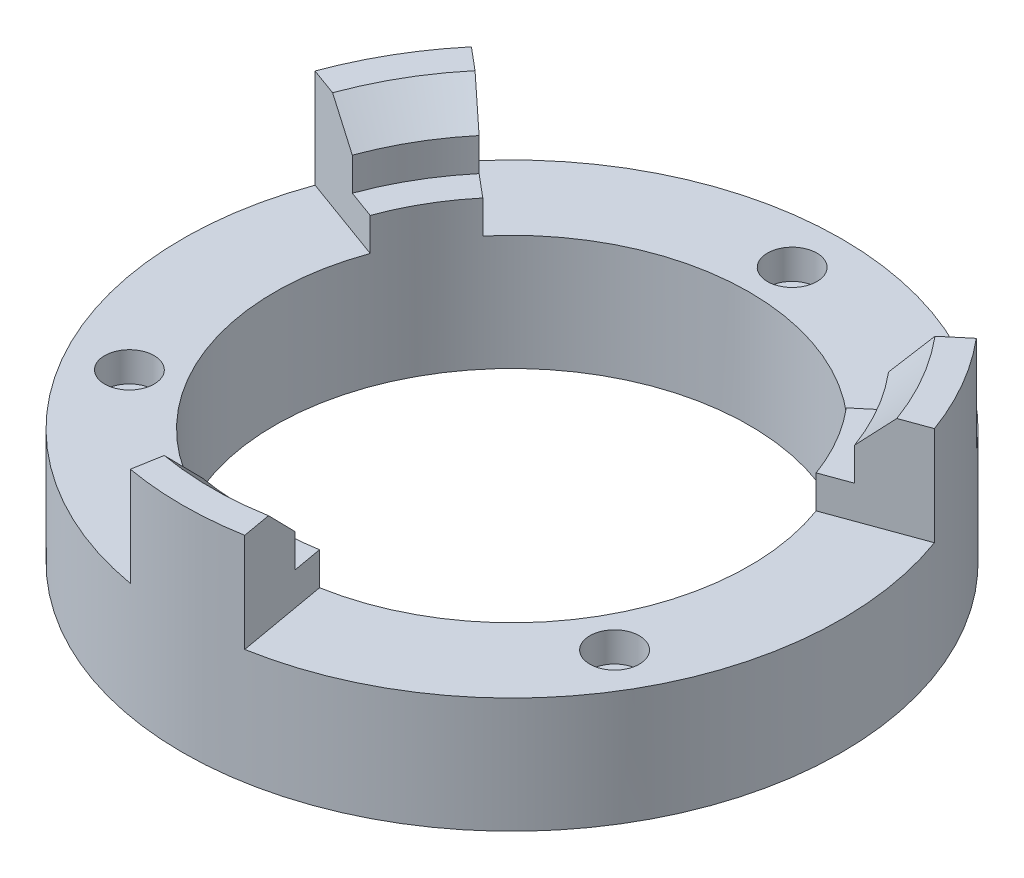
ISO-10303-21;
HEADER;
FILE_DESCRIPTION(('STEP AP214'),'2;1');
FILE_NAME('part.step','',(''),(''),'','','');
FILE_SCHEMA(('AUTOMOTIVE_DESIGN { 1 0 10303 214 1 1 1 1 }'));
ENDSEC;
DATA;
#1=APPLICATION_CONTEXT('core data for automotive mechanical design processes');
#2=APPLICATION_PROTOCOL_DEFINITION('international standard','automotive_design',2000,#1);
#3=PRODUCT_CONTEXT('',#1,'mechanical');
#4=PRODUCT('Part','Part','',(#3));
#5=PRODUCT_RELATED_PRODUCT_CATEGORY('part','',(#4));
#6=PRODUCT_DEFINITION_FORMATION('','',#4);
#7=PRODUCT_DEFINITION_CONTEXT('part definition',#1,'design');
#8=PRODUCT_DEFINITION('design','',#6,#7);
#9=PRODUCT_DEFINITION_SHAPE('','',#8);
#10=(LENGTH_UNIT() NAMED_UNIT(*) SI_UNIT(.MILLI.,.METRE.));
#11=(NAMED_UNIT(*) PLANE_ANGLE_UNIT() SI_UNIT($,.RADIAN.));
#12=(NAMED_UNIT(*) SI_UNIT($,.STERADIAN.) SOLID_ANGLE_UNIT());
#13=UNCERTAINTY_MEASURE_WITH_UNIT(LENGTH_MEASURE(1.E-05),#10,'distance_accuracy_value','');
#14=(GEOMETRIC_REPRESENTATION_CONTEXT(3) GLOBAL_UNCERTAINTY_ASSIGNED_CONTEXT((#13)) GLOBAL_UNIT_ASSIGNED_CONTEXT((#10,
#11,#12)) REPRESENTATION_CONTEXT('',''));
#15=CARTESIAN_POINT('',(0.,0.,0.));
#16=DIRECTION('',(0.,0.,1.));
#17=DIRECTION('',(1.,0.,0.));
#18=AXIS2_PLACEMENT_3D('',#15,#16,#17);
#19=CARTESIAN_POINT('',(0.,65.,0.));
#20=DIRECTION('',(0.,1.,0.));
#21=DIRECTION('',(0.,0.,1.));
#22=AXIS2_PLACEMENT_3D('',#19,#20,#21);
#23=PLANE('',#22);
#24=DIRECTION('',(-0.939692620785905,0.,-0.342020143325679));
#25=VECTOR('',#24,1.);
#26=CARTESIAN_POINT('',(0.,65.,0.));
#27=LINE('',#26,#25);
#28=CARTESIAN_POINT('',(-85.6059977535959,65.,-31.1580350569694));
#29=VERTEX_POINT('',#28);
#30=CARTESIAN_POINT('',(-93.9692620785905,65.,-34.2020143325679));
#31=VERTEX_POINT('',#30);
#32=EDGE_CURVE('E254',#29,#31,#27,.T.);
#33=ORIENTED_EDGE('',*,*,#32,.F.);
#34=CARTESIAN_POINT('',(0.,65.,0.));
#35=DIRECTION('',(0.,1.,0.));
#36=DIRECTION('',(0.,0.,1.));
#37=AXIS2_PLACEMENT_3D('',#34,#35,#36);
#38=CIRCLE('',#37,91.1);
#39=CARTESIAN_POINT('',(-69.7866487681386,65.,-58.5579512424442));
#40=VERTEX_POINT('',#39);
#41=EDGE_CURVE('E377',#29,#40,#38,.F.);
#42=ORIENTED_EDGE('',*,*,#41,.T.);
#43=DIRECTION('',(0.766044443118975,0.,0.642787609686543));
#44=VECTOR('',#43,1.);
#45=CARTESIAN_POINT('',(-620.584017996697,65.,-520.731820615549));
#46=LINE('',#45,#44);
#47=CARTESIAN_POINT('',(-76.6044443118974,65.,-64.2787609686543));
#48=VERTEX_POINT('',#47);
#49=EDGE_CURVE('E698',#48,#40,#46,.T.);
#50=ORIENTED_EDGE('',*,*,#49,.F.);
#51=CARTESIAN_POINT('',(0.,65.,0.));
#52=DIRECTION('',(0.,1.,0.));
#53=DIRECTION('',(0.,0.,1.));
#54=AXIS2_PLACEMENT_3D('',#51,#52,#53);
#55=CIRCLE('',#54,100.);
#56=EDGE_CURVE('E359',#48,#31,#55,.T.);
#57=ORIENTED_EDGE('',*,*,#56,.T.);
#58=EDGE_LOOP('',(#33,#42,#50,#57));
#59=FACE_BOUND('',#58,.T.);
#60=ADVANCED_FACE('F17',(#59),#23,.T.);
#61=CARTESIAN_POINT('',(0.,45.,0.));
#62=DIRECTION('',(0.,1.,0.));
#63=DIRECTION('',(0.,0.,1.));
#64=AXIS2_PLACEMENT_3D('',#61,#62,#63);
#65=CYLINDRICAL_SURFACE('',#64,81.1);
#66=CARTESIAN_POINT('',(0.,55.,0.));
#67=DIRECTION('',(0.,1.,0.));
#68=DIRECTION('',(0.,0.,1.));
#69=AXIS2_PLACEMENT_3D('',#66,#67,#68);
#70=CIRCLE('',#69,81.1);
#71=CARTESIAN_POINT('',(-62.1262043369488,55.,-52.1300751455787));
#72=VERTEX_POINT('',#71);
#73=CARTESIAN_POINT('',(-76.2090715457369,55.,-27.7378336237126));
#74=VERTEX_POINT('',#73);
#75=EDGE_CURVE('E370',#72,#74,#70,.T.);
#76=ORIENTED_EDGE('',*,*,#75,.T.);
#77=DIRECTION('',(0.,1.,0.));
#78=VECTOR('',#77,1.);
#79=CARTESIAN_POINT('',(-76.2090715457369,45.,-27.7378336237126));
#80=LINE('',#79,#78);
#81=CARTESIAN_POINT('',(-76.2090715457369,45.,-27.7378336237126));
#82=VERTEX_POINT('',#81);
#83=EDGE_CURVE('E235',#74,#82,#80,.F.);
#84=ORIENTED_EDGE('',*,*,#83,.T.);
#85=CARTESIAN_POINT('',(0.,45.,0.));
#86=DIRECTION('',(0.,1.,0.));
#87=DIRECTION('',(0.,0.,1.));
#88=AXIS2_PLACEMENT_3D('',#85,#86,#87);
#89=CIRCLE('',#88,81.1);
#90=CARTESIAN_POINT('',(-62.1262043369488,45.,-52.1300751455787));
#91=VERTEX_POINT('',#90);
#92=EDGE_CURVE('E361',#91,#82,#89,.T.);
#93=ORIENTED_EDGE('',*,*,#92,.F.);
#94=DIRECTION('',(0.,1.,0.));
#95=VECTOR('',#94,1.);
#96=CARTESIAN_POINT('',(-62.1262043369488,45.,-52.1300751455787));
#97=LINE('',#96,#95);
#98=EDGE_CURVE('E679',#91,#72,#97,.T.);
#99=ORIENTED_EDGE('',*,*,#98,.T.);
#100=EDGE_LOOP('',(#76,#84,#93,#99));
#101=FACE_BOUND('',#100,.T.);
#102=ADVANCED_FACE('F312',(#101),#65,.F.);
#103=CARTESIAN_POINT('',(0.,45.,0.));
#104=DIRECTION('',(0.,1.,0.));
#105=DIRECTION('',(0.,0.,1.));
#106=AXIS2_PLACEMENT_3D('',#103,#104,#105);
#107=PLANE('',#106);
#108=DIRECTION('',(-0.939692620785905,0.,-0.342020143325679));
#109=VECTOR('',#108,1.);
#110=CARTESIAN_POINT('',(0.,45.,0.));
#111=LINE('',#110,#109);
#112=CARTESIAN_POINT('',(-67.6578686965851,45.,-24.6254503194488));
#113=VERTEX_POINT('',#112);
#114=EDGE_CURVE('E238',#113,#82,#111,.T.);
#115=ORIENTED_EDGE('',*,*,#114,.F.);
#116=CARTESIAN_POINT('',(0.,45.,0.));
#117=DIRECTION('',(0.,1.,0.));
#118=DIRECTION('',(0.,0.,1.));
#119=AXIS2_PLACEMENT_3D('',#116,#117,#118);
#120=CIRCLE('',#119,72.);
#121=CARTESIAN_POINT('',(-55.1551999045661,45.,-46.2807078974312));
#122=VERTEX_POINT('',#121);
#123=EDGE_CURVE('E179',#122,#113,#120,.T.);
#124=ORIENTED_EDGE('',*,*,#123,.F.);
#125=DIRECTION('',(0.766044443118975,0.,0.642787609686543));
#126=VECTOR('',#125,1.);
#127=CARTESIAN_POINT('',(0.,45.,0.));
#128=LINE('',#127,#126);
#129=EDGE_CURVE('E694',#91,#122,#128,.T.);
#130=ORIENTED_EDGE('',*,*,#129,.F.);
#131=ORIENTED_EDGE('',*,*,#92,.T.);
#132=EDGE_LOOP('',(#115,#124,#130,#131));
#133=FACE_BOUND('',#132,.T.);
#134=ADVANCED_FACE('F321',(#133),#107,.T.);
#135=CARTESIAN_POINT('',(0.,55.,0.));
#136=DIRECTION('',(0.,1.,0.));
#137=DIRECTION('',(0.,0.,1.));
#138=AXIS2_PLACEMENT_3D('',#135,#136,#137);
#139=CONICAL_SURFACE('',#138,81.1,0.785398163397452);
#140=DIRECTION('',(-0.664463024388674,0.707106781186545,-0.241844762647983));
#141=VECTOR('',#140,1.);
#142=CARTESIAN_POINT('',(0.,-26.0999999999994,0.));
#143=LINE('',#142,#141);
#144=EDGE_CURVE('E233',#74,#29,#143,.T.);
#145=ORIENTED_EDGE('',*,*,#144,.F.);
#146=ORIENTED_EDGE('',*,*,#75,.F.);
#147=DIRECTION('',(0.541675220419701,-0.707106781186545,0.454519477672048));
#148=VECTOR('',#147,1.);
#149=CARTESIAN_POINT('',(0.,-26.0999999999994,0.));
#150=LINE('',#149,#148);
#151=EDGE_CURVE('E385',#40,#72,#150,.T.);
#152=ORIENTED_EDGE('',*,*,#151,.F.);
#153=ORIENTED_EDGE('',*,*,#41,.F.);
#154=EDGE_LOOP('',(#145,#146,#152,#153));
#155=FACE_BOUND('',#154,.T.);
#156=ADVANCED_FACE('F329',(#155),#139,.F.);
#157=DIRECTION('',(0.173648177666945,0.,-0.984807753012206));
#158=VECTOR('',#157,1.);
#159=CARTESIAN_POINT('',(-140.674976213645,65.,797.807435075532));
#160=LINE('',#159,#158);
#161=CARTESIAN_POINT('',(-17.3648177666945,65.,98.4807753012206));
#162=VERTEX_POINT('',#161);
#163=CARTESIAN_POINT('',(-15.8193489854587,65.,89.7159862994119));
#164=VERTEX_POINT('',#163);
#165=EDGE_CURVE('E251',#162,#164,#160,.T.);
#166=ORIENTED_EDGE('',*,*,#165,.F.);
#167=CARTESIAN_POINT('',(17.3648177666925,65.,98.480775301221));
#168=VERTEX_POINT('',#167);
#169=EDGE_CURVE('E356',#162,#168,#55,.T.);
#170=ORIENTED_EDGE('',*,*,#169,.T.);
#171=DIRECTION('',(0.173648177666925,0.,0.984807753012209));
#172=VECTOR('',#171,1.);
#173=CARTESIAN_POINT('',(0.,65.,0.));
#174=LINE('',#173,#172);
#175=CARTESIAN_POINT('',(15.8193489854568,65.,89.7159862994123));
#176=VERTEX_POINT('',#175);
#177=EDGE_CURVE('E226',#176,#168,#174,.T.);
#178=ORIENTED_EDGE('',*,*,#177,.F.);
#179=EDGE_CURVE('E380',#176,#164,#38,.F.);
#180=ORIENTED_EDGE('',*,*,#179,.T.);
#181=EDGE_LOOP('',(#166,#170,#178,#180));
#182=FACE_BOUND('',#181,.T.);
#183=ADVANCED_FACE('F315',(#182),#23,.T.);
#184=CARTESIAN_POINT('',(-14.0828672087893,45.,79.8679087692898));
#185=VERTEX_POINT('',#184);
#186=CARTESIAN_POINT('',(14.0828672087875,45.,79.8679087692902));
#187=VERTEX_POINT('',#186);
#188=EDGE_CURVE('E408',#185,#187,#89,.T.);
#189=ORIENTED_EDGE('',*,*,#188,.F.);
#190=DIRECTION('',(0.,1.,0.));
#191=VECTOR('',#190,1.);
#192=CARTESIAN_POINT('',(-14.0828672087893,45.,79.8679087692898));
#193=LINE('',#192,#191);
#194=CARTESIAN_POINT('',(-14.0828672087893,55.,79.8679087692898));
#195=VERTEX_POINT('',#194);
#196=EDGE_CURVE('E245',#185,#195,#193,.T.);
#197=ORIENTED_EDGE('',*,*,#196,.T.);
#198=CARTESIAN_POINT('',(14.0828672087875,55.,79.8679087692902));
#199=VERTEX_POINT('',#198);
#200=EDGE_CURVE('E368',#195,#199,#70,.T.);
#201=ORIENTED_EDGE('',*,*,#200,.T.);
#202=DIRECTION('',(0.,1.,0.));
#203=VECTOR('',#202,1.);
#204=CARTESIAN_POINT('',(14.0828672087875,45.,79.8679087692902));
#205=LINE('',#204,#203);
#206=EDGE_CURVE('E203',#199,#187,#205,.F.);
#207=ORIENTED_EDGE('',*,*,#206,.T.);
#208=EDGE_LOOP('',(#189,#197,#201,#207));
#209=FACE_BOUND('',#208,.T.);
#210=ADVANCED_FACE('F324',(#209),#65,.F.);
#211=DIRECTION('',(0.173648177666945,0.,-0.984807753012206));
#212=VECTOR('',#211,1.);
#213=CARTESIAN_POINT('',(0.,45.,0.));
#214=LINE('',#213,#212);
#215=CARTESIAN_POINT('',(-12.5026687920201,45.,70.9061582168788));
#216=VERTEX_POINT('',#215);
#217=EDGE_CURVE('E248',#185,#216,#214,.T.);
#218=ORIENTED_EDGE('',*,*,#217,.F.);
#219=ORIENTED_EDGE('',*,*,#188,.T.);
#220=DIRECTION('',(0.173648177666924,0.,0.984807753012209));
#221=VECTOR('',#220,1.);
#222=CARTESIAN_POINT('',(0.,45.,0.));
#223=LINE('',#222,#221);
#224=CARTESIAN_POINT('',(12.5026687920185,45.,70.9061582168791));
#225=VERTEX_POINT('',#224);
#226=EDGE_CURVE('E208',#225,#187,#223,.T.);
#227=ORIENTED_EDGE('',*,*,#226,.F.);
#228=EDGE_CURVE('E186',#216,#225,#120,.T.);
#229=ORIENTED_EDGE('',*,*,#228,.F.);
#230=EDGE_LOOP('',(#218,#219,#227,#229));
#231=FACE_BOUND('',#230,.T.);
#232=ADVANCED_FACE('F406',(#231),#107,.T.);
#233=DIRECTION('',(0.122787803968983,-0.707106781186545,-0.69636424032002));
#234=VECTOR('',#233,1.);
#235=CARTESIAN_POINT('',(0.,-26.0999999999994,0.));
#236=LINE('',#235,#234);
#237=EDGE_CURVE('E243',#164,#195,#236,.T.);
#238=ORIENTED_EDGE('',*,*,#237,.F.);
#239=ORIENTED_EDGE('',*,*,#179,.F.);
#240=DIRECTION('',(0.122787803968969,0.707106781186545,0.696364240320022));
#241=VECTOR('',#240,1.);
#242=CARTESIAN_POINT('',(0.,-26.0999999999994,0.));
#243=LINE('',#242,#241);
#244=EDGE_CURVE('E198',#199,#176,#243,.T.);
#245=ORIENTED_EDGE('',*,*,#244,.F.);
#246=ORIENTED_EDGE('',*,*,#200,.F.);
#247=EDGE_LOOP('',(#238,#239,#245,#246));
#248=FACE_BOUND('',#247,.T.);
#249=ADVANCED_FACE('F341',(#248),#139,.F.);
#250=CARTESIAN_POINT('',(0.,65.,0.));
#251=DIRECTION('',(0.,-1.,0.));
#252=DIRECTION('',(0.,0.,-1.));
#253=AXIS2_PLACEMENT_3D('',#250,#251,#252);
#254=CYLINDRICAL_SURFACE('',#253,100.);
#255=CARTESIAN_POINT('',(0.,35.,0.));
#256=DIRECTION('',(0.,-1.,0.));
#257=DIRECTION('',(0.,0.,-1.));
#258=AXIS2_PLACEMENT_3D('',#255,#256,#257);
#259=CIRCLE('',#258,100.);
#260=CARTESIAN_POINT('',(-17.3648177666945,35.,98.4807753012206));
#261=VERTEX_POINT('',#260);
#262=CARTESIAN_POINT('',(-93.9692620785905,35.,-34.2020143325679));
#263=VERTEX_POINT('',#262);
#264=EDGE_CURVE('E250',#261,#263,#259,.T.);
#265=ORIENTED_EDGE('',*,*,#264,.T.);
#266=DIRECTION('',(0.,-1.,0.));
#267=VECTOR('',#266,1.);
#268=CARTESIAN_POINT('',(-93.9692620785905,65.,-34.2020143325679));
#269=LINE('',#268,#267);
#270=EDGE_CURVE('E172',#263,#31,#269,.F.);
#271=ORIENTED_EDGE('',*,*,#270,.T.);
#272=ORIENTED_EDGE('',*,*,#56,.F.);
#273=DIRECTION('',(0.,-1.,0.));
#274=VECTOR('',#273,1.);
#275=CARTESIAN_POINT('',(-76.6044443118974,65.,-64.2787609686544));
#276=LINE('',#275,#274);
#277=CARTESIAN_POINT('',(-76.6044443118974,35.,-64.2787609686544));
#278=VERTEX_POINT('',#277);
#279=EDGE_CURVE('E691',#48,#278,#276,.T.);
#280=ORIENTED_EDGE('',*,*,#279,.T.);
#281=CARTESIAN_POINT('',(0.,35.,0.));
#282=DIRECTION('',(0.,-1.,0.));
#283=DIRECTION('',(0.,0.,-1.));
#284=AXIS2_PLACEMENT_3D('',#281,#282,#283);
#285=CIRCLE('',#284,100.);
#286=CARTESIAN_POINT('',(76.6044443118979,35.,-64.2787609686538));
#287=VERTEX_POINT('',#286);
#288=EDGE_CURVE('E389',#278,#287,#285,.T.);
#289=ORIENTED_EDGE('',*,*,#288,.T.);
#290=DIRECTION('',(0.,-1.,0.));
#291=VECTOR('',#290,1.);
#292=CARTESIAN_POINT('',(76.6044443118979,65.,-64.2787609686538));
#293=LINE('',#292,#291);
#294=CARTESIAN_POINT('',(76.6044443118979,65.,-64.2787609686538));
#295=VERTEX_POINT('',#294);
#296=EDGE_CURVE('E355',#287,#295,#293,.F.);
#297=ORIENTED_EDGE('',*,*,#296,.T.);
#298=CARTESIAN_POINT('',(93.9692620785909,65.,-34.2020143325658));
#299=VERTEX_POINT('',#298);
#300=EDGE_CURVE('E346',#299,#295,#55,.T.);
#301=ORIENTED_EDGE('',*,*,#300,.F.);
#302=DIRECTION('',(0.,-1.,0.));
#303=VECTOR('',#302,1.);
#304=CARTESIAN_POINT('',(93.9692620785912,65.,-34.2020143325659));
#305=LINE('',#304,#303);
#306=CARTESIAN_POINT('',(93.9692620785912,35.,-34.2020143325659));
#307=VERTEX_POINT('',#306);
#308=EDGE_CURVE('E211',#299,#307,#305,.T.);
#309=ORIENTED_EDGE('',*,*,#308,.T.);
#310=CARTESIAN_POINT('',(0.,35.,0.));
#311=DIRECTION('',(0.,-1.,0.));
#312=DIRECTION('',(0.,0.,-1.));
#313=AXIS2_PLACEMENT_3D('',#310,#311,#312);
#314=CIRCLE('',#313,100.);
#315=CARTESIAN_POINT('',(17.3648177666925,35.,98.4807753012209));
#316=VERTEX_POINT('',#315);
#317=EDGE_CURVE('E221',#307,#316,#314,.T.);
#318=ORIENTED_EDGE('',*,*,#317,.T.);
#319=DIRECTION('',(0.,-1.,0.));
#320=VECTOR('',#319,1.);
#321=CARTESIAN_POINT('',(17.3648177666924,65.,98.4807753012209));
#322=LINE('',#321,#320);
#323=EDGE_CURVE('E193',#316,#168,#322,.F.);
#324=ORIENTED_EDGE('',*,*,#323,.T.);
#325=ORIENTED_EDGE('',*,*,#169,.F.);
#326=DIRECTION('',(0.,-1.,0.));
#327=VECTOR('',#326,1.);
#328=CARTESIAN_POINT('',(-17.3648177666945,65.,98.4807753012206));
#329=LINE('',#328,#327);
#330=EDGE_CURVE('E240',#162,#261,#329,.T.);
#331=ORIENTED_EDGE('',*,*,#330,.T.);
#332=EDGE_LOOP('',(#265,#271,#272,#280,#289,#297,#301,#309,#318,#324,#325,#331));
#333=FACE_BOUND('',#332,.T.);
#334=CARTESIAN_POINT('',(0.,0.,0.));
#335=DIRECTION('',(0.,1.,0.));
#336=DIRECTION('',(0.,0.,1.));
#337=AXIS2_PLACEMENT_3D('',#334,#335,#336);
#338=CIRCLE('',#337,100.);
#339=CARTESIAN_POINT('',(0.,0.,100.));
#340=VERTEX_POINT('',#339);
#341=EDGE_CURVE('E357',#340,#340,#338,.T.);
#342=ORIENTED_EDGE('',*,*,#341,.T.);
#343=EDGE_LOOP('',(#342));
#344=FACE_BOUND('',#343,.T.);
#345=ADVANCED_FACE('F333',(#333,#344),#254,.T.);
#346=DIRECTION('',(-0.939692620785912,0.,0.342020143325659));
#347=VECTOR('',#346,1.);
#348=CARTESIAN_POINT('',(761.258994210337,65.,-277.075614459981));
#349=LINE('',#348,#347);
#350=CARTESIAN_POINT('',(85.6059977535966,65.,-31.1580350569675));
#351=VERTEX_POINT('',#350);
#352=EDGE_CURVE('E223',#299,#351,#349,.T.);
#353=ORIENTED_EDGE('',*,*,#352,.F.);
#354=ORIENTED_EDGE('',*,*,#300,.T.);
#355=DIRECTION('',(0.766044443118979,0.,-0.642787609686538));
#356=VECTOR('',#355,1.);
#357=CARTESIAN_POINT('',(0.,65.,0.));
#358=LINE('',#357,#356);
#359=CARTESIAN_POINT('',(69.786648768139,65.,-58.5579512424436));
#360=VERTEX_POINT('',#359);
#361=EDGE_CURVE('E701',#360,#295,#358,.T.);
#362=ORIENTED_EDGE('',*,*,#361,.F.);
#363=EDGE_CURVE('E349',#360,#351,#38,.F.);
#364=ORIENTED_EDGE('',*,*,#363,.T.);
#365=EDGE_LOOP('',(#353,#354,#362,#364));
#366=FACE_BOUND('',#365,.T.);
#367=ADVANCED_FACE('F316',(#366),#23,.T.);
#368=CARTESIAN_POINT('',(0.,0.,0.));
#369=DIRECTION('',(0.,1.,0.));
#370=DIRECTION('',(0.,0.,1.));
#371=AXIS2_PLACEMENT_3D('',#368,#369,#370);
#372=PLANE('',#371);
#373=CARTESIAN_POINT('',(73.6121593216777,0.,42.4999999999994));
#374=DIRECTION('',(0.,1.,0.));
#375=DIRECTION('',(-0.866025403784443,0.,-0.499999999999992));
#376=AXIS2_PLACEMENT_3D('',#373,#374,#375);
#377=CIRCLE('',#376,4.5);
#378=CARTESIAN_POINT('',(69.7150450046477,0.,40.2499999999994));
#379=VERTEX_POINT('',#378);
#380=EDGE_CURVE('E286',#379,#379,#377,.T.);
#381=ORIENTED_EDGE('',*,*,#380,.T.);
#382=EDGE_LOOP('',(#381));
#383=FACE_BOUND('',#382,.T.);
#384=CARTESIAN_POINT('',(-73.6121593216771,0.,42.5));
#385=DIRECTION('',(0.,1.,0.));
#386=DIRECTION('',(0.866025403784437,0.,-0.5));
#387=AXIS2_PLACEMENT_3D('',#384,#385,#386);
#388=CIRCLE('',#387,4.5);
#389=CARTESIAN_POINT('',(-69.7150450046471,0.,40.25));
#390=VERTEX_POINT('',#389);
#391=EDGE_CURVE('E274',#390,#390,#388,.T.);
#392=ORIENTED_EDGE('',*,*,#391,.T.);
#393=EDGE_LOOP('',(#392));
#394=FACE_BOUND('',#393,.T.);
#395=CARTESIAN_POINT('',(0.,0.,-85.));
#396=DIRECTION('',(0.,1.,0.));
#397=DIRECTION('',(0.,0.,1.));
#398=AXIS2_PLACEMENT_3D('',#395,#396,#397);
#399=CIRCLE('',#398,4.5);
#400=CARTESIAN_POINT('',(0.,0.,-80.5));
#401=VERTEX_POINT('',#400);
#402=EDGE_CURVE('E173',#401,#401,#399,.T.);
#403=ORIENTED_EDGE('',*,*,#402,.T.);
#404=EDGE_LOOP('',(#403));
#405=FACE_BOUND('',#404,.T.);
#406=CARTESIAN_POINT('',(0.,0.,0.));
#407=DIRECTION('',(0.,1.,0.));
#408=DIRECTION('',(0.,0.,1.));
#409=AXIS2_PLACEMENT_3D('',#406,#407,#408);
#410=CIRCLE('',#409,72.);
#411=CARTESIAN_POINT('',(0.,0.,72.));
#412=VERTEX_POINT('',#411);
#413=EDGE_CURVE('E185',#412,#412,#410,.T.);
#414=ORIENTED_EDGE('',*,*,#413,.T.);
#415=EDGE_LOOP('',(#414));
#416=FACE_BOUND('',#415,.T.);
#417=ORIENTED_EDGE('',*,*,#341,.F.);
#418=EDGE_LOOP('',(#417));
#419=FACE_BOUND('',#418,.T.);
#420=ADVANCED_FACE('F332',(#383,#394,#405,#416,#419),#372,.F.);
#421=CARTESIAN_POINT('',(76.2090715457374,45.,-27.7378336237109));
#422=VERTEX_POINT('',#421);
#423=CARTESIAN_POINT('',(62.1262043369492,45.,-52.1300751455782));
#424=VERTEX_POINT('',#423);
#425=EDGE_CURVE('E680',#422,#424,#89,.T.);
#426=ORIENTED_EDGE('',*,*,#425,.F.);
#427=DIRECTION('',(0.,1.,0.));
#428=VECTOR('',#427,1.);
#429=CARTESIAN_POINT('',(76.2090715457374,45.,-27.7378336237109));
#430=LINE('',#429,#428);
#431=CARTESIAN_POINT('',(76.2090715457374,55.,-27.7378336237109));
#432=VERTEX_POINT('',#431);
#433=EDGE_CURVE('E216',#422,#432,#430,.T.);
#434=ORIENTED_EDGE('',*,*,#433,.T.);
#435=CARTESIAN_POINT('',(62.1262043369492,55.,-52.1300751455782));
#436=VERTEX_POINT('',#435);
#437=EDGE_CURVE('E365',#432,#436,#70,.T.);
#438=ORIENTED_EDGE('',*,*,#437,.T.);
#439=DIRECTION('',(0.,1.,0.));
#440=VECTOR('',#439,1.);
#441=CARTESIAN_POINT('',(62.1262043369492,45.,-52.1300751455782));
#442=LINE('',#441,#440);
#443=EDGE_CURVE('E687',#436,#424,#442,.F.);
#444=ORIENTED_EDGE('',*,*,#443,.T.);
#445=EDGE_LOOP('',(#426,#434,#438,#444));
#446=FACE_BOUND('',#445,.T.);
#447=ADVANCED_FACE('F325',(#446),#65,.F.);
#448=DIRECTION('',(-0.939692620785912,0.,0.342020143325659));
#449=VECTOR('',#448,1.);
#450=CARTESIAN_POINT('',(0.,45.,0.));
#451=LINE('',#450,#449);
#452=CARTESIAN_POINT('',(67.6578686965857,45.,-24.6254503194475));
#453=VERTEX_POINT('',#452);
#454=EDGE_CURVE('E219',#422,#453,#451,.T.);
#455=ORIENTED_EDGE('',*,*,#454,.F.);
#456=ORIENTED_EDGE('',*,*,#425,.T.);
#457=DIRECTION('',(0.766044443118979,0.,-0.642787609686538));
#458=VECTOR('',#457,1.);
#459=CARTESIAN_POINT('',(0.,45.,0.));
#460=LINE('',#459,#458);
#461=CARTESIAN_POINT('',(55.1551999045665,45.,-46.2807078974308));
#462=VERTEX_POINT('',#461);
#463=EDGE_CURVE('E686',#462,#424,#460,.T.);
#464=ORIENTED_EDGE('',*,*,#463,.F.);
#465=EDGE_CURVE('E188',#453,#462,#120,.T.);
#466=ORIENTED_EDGE('',*,*,#465,.F.);
#467=EDGE_LOOP('',(#455,#456,#464,#466));
#468=FACE_BOUND('',#467,.T.);
#469=ADVANCED_FACE('F591',(#468),#107,.T.);
#470=DIRECTION('',(-0.66446302438868,-0.707106781186545,0.24184476264797));
#471=VECTOR('',#470,1.);
#472=CARTESIAN_POINT('',(0.,-26.0999999999994,0.));
#473=LINE('',#472,#471);
#474=EDGE_CURVE('E214',#351,#432,#473,.T.);
#475=ORIENTED_EDGE('',*,*,#474,.F.);
#476=ORIENTED_EDGE('',*,*,#363,.F.);
#477=DIRECTION('',(0.541675220419705,0.707106781186545,-0.454519477672045));
#478=VECTOR('',#477,1.);
#479=CARTESIAN_POINT('',(0.,-26.0999999999994,0.));
#480=LINE('',#479,#478);
#481=EDGE_CURVE('E386',#436,#360,#480,.T.);
#482=ORIENTED_EDGE('',*,*,#481,.F.);
#483=ORIENTED_EDGE('',*,*,#437,.F.);
#484=EDGE_LOOP('',(#475,#476,#482,#483));
#485=FACE_BOUND('',#484,.T.);
#486=ADVANCED_FACE('F19',(#485),#139,.F.);
#487=CARTESIAN_POINT('',(0.,35.,0.));
#488=DIRECTION('',(0.,-1.,0.));
#489=DIRECTION('',(0.,0.,-1.));
#490=AXIS2_PLACEMENT_3D('',#487,#488,#489);
#491=PLANE('',#490);
#492=CARTESIAN_POINT('',(0.,35.,-85.));
#493=DIRECTION('',(0.,1.,0.));
#494=DIRECTION('',(0.,0.,1.));
#495=AXIS2_PLACEMENT_3D('',#492,#493,#494);
#496=CIRCLE('',#495,7.5);
#497=CARTESIAN_POINT('',(0.,35.,-77.5));
#498=VERTEX_POINT('',#497);
#499=EDGE_CURVE('E265',#498,#498,#496,.T.);
#500=ORIENTED_EDGE('',*,*,#499,.F.);
#501=EDGE_LOOP('',(#500));
#502=FACE_BOUND('',#501,.T.);
#503=DIRECTION('',(0.766044443118975,0.,0.642787609686543));
#504=VECTOR('',#503,1.);
#505=CARTESIAN_POINT('',(-620.584017996697,35.,-520.731820615549));
#506=LINE('',#505,#504);
#507=CARTESIAN_POINT('',(-55.1551999045661,35.,-46.2807078974311));
#508=VERTEX_POINT('',#507);
#509=EDGE_CURVE('E697',#278,#508,#506,.T.);
#510=ORIENTED_EDGE('',*,*,#509,.T.);
#511=CARTESIAN_POINT('',(0.,35.,0.));
#512=DIRECTION('',(0.,-1.,0.));
#513=DIRECTION('',(0.,0.,-1.));
#514=AXIS2_PLACEMENT_3D('',#511,#512,#513);
#515=CIRCLE('',#514,72.);
#516=CARTESIAN_POINT('',(55.1551999045665,35.,-46.2807078974308));
#517=VERTEX_POINT('',#516);
#518=EDGE_CURVE('E190',#508,#517,#515,.T.);
#519=ORIENTED_EDGE('',*,*,#518,.T.);
#520=DIRECTION('',(0.766044443118979,0.,-0.642787609686538));
#521=VECTOR('',#520,1.);
#522=CARTESIAN_POINT('',(0.,35.,0.));
#523=LINE('',#522,#521);
#524=EDGE_CURVE('E700',#517,#287,#523,.T.);
#525=ORIENTED_EDGE('',*,*,#524,.T.);
#526=ORIENTED_EDGE('',*,*,#288,.F.);
#527=EDGE_LOOP('',(#510,#519,#525,#526));
#528=FACE_BOUND('',#527,.T.);
#529=ADVANCED_FACE('F572',(#502,#528),#491,.F.);
#530=CARTESIAN_POINT('',(0.,35.,0.));
#531=DIRECTION('',(0.642787609686538,0.,0.766044443118979));
#532=DIRECTION('',(0.766044443118979,0.,-0.642787609686538));
#533=AXIS2_PLACEMENT_3D('',#530,#531,#532);
#534=PLANE('',#533);
#535=ORIENTED_EDGE('',*,*,#524,.F.);
#536=DIRECTION('',(0.,1.,0.));
#537=VECTOR('',#536,1.);
#538=CARTESIAN_POINT('',(55.1551999045665,0.,-46.2807078974308));
#539=LINE('',#538,#537);
#540=EDGE_CURVE('E703',#517,#462,#539,.T.);
#541=ORIENTED_EDGE('',*,*,#540,.T.);
#542=ORIENTED_EDGE('',*,*,#463,.T.);
#543=ORIENTED_EDGE('',*,*,#443,.F.);
#544=ORIENTED_EDGE('',*,*,#481,.T.);
#545=ORIENTED_EDGE('',*,*,#361,.T.);
#546=ORIENTED_EDGE('',*,*,#296,.F.);
#547=EDGE_LOOP('',(#535,#541,#542,#543,#544,#545,#546));
#548=FACE_BOUND('',#547,.T.);
#549=ADVANCED_FACE('F563',(#548),#534,.F.);
#550=CARTESIAN_POINT('',(-620.584017996697,35.,-520.731820615549));
#551=DIRECTION('',(-0.642787609686543,0.,0.766044443118975));
#552=DIRECTION('',(0.766044443118975,0.,0.642787609686543));
#553=AXIS2_PLACEMENT_3D('',#550,#551,#552);
#554=PLANE('',#553);
#555=ORIENTED_EDGE('',*,*,#129,.T.);
#556=DIRECTION('',(0.,1.,0.));
#557=VECTOR('',#556,1.);
#558=CARTESIAN_POINT('',(-55.1551999045661,0.,-46.2807078974312));
#559=LINE('',#558,#557);
#560=EDGE_CURVE('E181',#122,#508,#559,.F.);
#561=ORIENTED_EDGE('',*,*,#560,.T.);
#562=ORIENTED_EDGE('',*,*,#509,.F.);
#563=ORIENTED_EDGE('',*,*,#279,.F.);
#564=ORIENTED_EDGE('',*,*,#49,.T.);
#565=ORIENTED_EDGE('',*,*,#151,.T.);
#566=ORIENTED_EDGE('',*,*,#98,.F.);
#567=EDGE_LOOP('',(#555,#561,#562,#563,#564,#565,#566));
#568=FACE_BOUND('',#567,.T.);
#569=ADVANCED_FACE('F554',(#568),#554,.F.);
#570=CARTESIAN_POINT('',(0.,0.,0.));
#571=DIRECTION('',(0.,1.,0.));
#572=DIRECTION('',(0.,0.,1.));
#573=AXIS2_PLACEMENT_3D('',#570,#571,#572);
#574=CYLINDRICAL_SURFACE('',#573,72.);
#575=ORIENTED_EDGE('',*,*,#123,.T.);
#576=DIRECTION('',(0.,1.,0.));
#577=VECTOR('',#576,1.);
#578=CARTESIAN_POINT('',(-67.6578686965851,0.,-24.6254503194488));
#579=LINE('',#578,#577);
#580=CARTESIAN_POINT('',(-67.6578686965851,35.,-24.6254503194489));
#581=VERTEX_POINT('',#580);
#582=EDGE_CURVE('E11',#113,#581,#579,.F.);
#583=ORIENTED_EDGE('',*,*,#582,.T.);
#584=CARTESIAN_POINT('',(0.,35.,0.));
#585=DIRECTION('',(0.,-1.,0.));
#586=DIRECTION('',(0.,0.,-1.));
#587=AXIS2_PLACEMENT_3D('',#584,#585,#586);
#588=CIRCLE('',#587,72.);
#589=CARTESIAN_POINT('',(-12.5026687920201,35.,70.9061582168788));
#590=VERTEX_POINT('',#589);
#591=EDGE_CURVE('E159',#581,#590,#588,.F.);
#592=ORIENTED_EDGE('',*,*,#591,.T.);
#593=DIRECTION('',(0.,1.,0.));
#594=VECTOR('',#593,1.);
#595=CARTESIAN_POINT('',(-12.5026687920201,0.,70.9061582168788));
#596=LINE('',#595,#594);
#597=EDGE_CURVE('E25',#590,#216,#596,.T.);
#598=ORIENTED_EDGE('',*,*,#597,.T.);
#599=ORIENTED_EDGE('',*,*,#228,.T.);
#600=DIRECTION('',(0.,1.,0.));
#601=VECTOR('',#600,1.);
#602=CARTESIAN_POINT('',(12.5026687920185,0.,70.9061582168791));
#603=LINE('',#602,#601);
#604=CARTESIAN_POINT('',(12.5026687920185,35.,70.9061582168791));
#605=VERTEX_POINT('',#604);
#606=EDGE_CURVE('E166',#225,#605,#603,.F.);
#607=ORIENTED_EDGE('',*,*,#606,.T.);
#608=CARTESIAN_POINT('',(0.,35.,0.));
#609=DIRECTION('',(0.,-1.,0.));
#610=DIRECTION('',(0.,0.,-1.));
#611=AXIS2_PLACEMENT_3D('',#608,#609,#610);
#612=CIRCLE('',#611,72.);
#613=CARTESIAN_POINT('',(67.6578686965857,35.,-24.6254503194475));
#614=VERTEX_POINT('',#613);
#615=EDGE_CURVE('E394',#605,#614,#612,.F.);
#616=ORIENTED_EDGE('',*,*,#615,.T.);
#617=DIRECTION('',(0.,1.,0.));
#618=VECTOR('',#617,1.);
#619=CARTESIAN_POINT('',(67.6578686965857,0.,-24.6254503194475));
#620=LINE('',#619,#618);
#621=EDGE_CURVE('E397',#614,#453,#620,.T.);
#622=ORIENTED_EDGE('',*,*,#621,.T.);
#623=ORIENTED_EDGE('',*,*,#465,.T.);
#624=ORIENTED_EDGE('',*,*,#540,.F.);
#625=ORIENTED_EDGE('',*,*,#518,.F.);
#626=ORIENTED_EDGE('',*,*,#560,.F.);
#627=EDGE_LOOP('',(#575,#583,#592,#598,#599,#607,#616,#622,#623,#624,#625,#626));
#628=FACE_BOUND('',#627,.T.);
#629=ORIENTED_EDGE('',*,*,#413,.F.);
#630=EDGE_LOOP('',(#629));
#631=FACE_BOUND('',#630,.T.);
#632=ADVANCED_FACE('F176',(#628,#631),#574,.F.);
#633=CARTESIAN_POINT('',(0.,35.,0.));
#634=DIRECTION('',(-0.984807753012209,0.,0.173648177666924));
#635=DIRECTION('',(0.173648177666924,0.,0.984807753012209));
#636=AXIS2_PLACEMENT_3D('',#633,#634,#635);
#637=PLANE('',#636);
#638=DIRECTION('',(0.173648177666925,0.,0.984807753012209));
#639=VECTOR('',#638,1.);
#640=CARTESIAN_POINT('',(0.,35.,0.));
#641=LINE('',#640,#639);
#642=EDGE_CURVE('E225',#605,#316,#641,.T.);
#643=ORIENTED_EDGE('',*,*,#642,.F.);
#644=ORIENTED_EDGE('',*,*,#606,.F.);
#645=ORIENTED_EDGE('',*,*,#226,.T.);
#646=ORIENTED_EDGE('',*,*,#206,.F.);
#647=ORIENTED_EDGE('',*,*,#244,.T.);
#648=ORIENTED_EDGE('',*,*,#177,.T.);
#649=ORIENTED_EDGE('',*,*,#323,.F.);
#650=EDGE_LOOP('',(#643,#644,#645,#646,#647,#648,#649));
#651=FACE_BOUND('',#650,.T.);
#652=ADVANCED_FACE('F307',(#651),#637,.F.);
#653=CARTESIAN_POINT('',(761.258994210337,35.,-277.075614459981));
#654=DIRECTION('',(-0.342020143325659,0.,-0.939692620785912));
#655=DIRECTION('',(-0.939692620785912,0.,0.342020143325659));
#656=AXIS2_PLACEMENT_3D('',#653,#654,#655);
#657=PLANE('',#656);
#658=ORIENTED_EDGE('',*,*,#352,.T.);
#659=ORIENTED_EDGE('',*,*,#474,.T.);
#660=ORIENTED_EDGE('',*,*,#433,.F.);
#661=ORIENTED_EDGE('',*,*,#454,.T.);
#662=ORIENTED_EDGE('',*,*,#621,.F.);
#663=DIRECTION('',(-0.939692620785912,0.,0.342020143325659));
#664=VECTOR('',#663,1.);
#665=CARTESIAN_POINT('',(761.258994210337,35.,-277.075614459981));
#666=LINE('',#665,#664);
#667=EDGE_CURVE('E40',#307,#614,#666,.T.);
#668=ORIENTED_EDGE('',*,*,#667,.F.);
#669=ORIENTED_EDGE('',*,*,#308,.F.);
#670=EDGE_LOOP('',(#658,#659,#660,#661,#662,#668,#669));
#671=FACE_BOUND('',#670,.T.);
#672=ADVANCED_FACE('F297',(#671),#657,.F.);
#673=CARTESIAN_POINT('',(0.,35.,0.));
#674=DIRECTION('',(0.,-1.,0.));
#675=DIRECTION('',(0.866025403784437,0.,0.5));
#676=AXIS2_PLACEMENT_3D('',#673,#674,#675);
#677=PLANE('',#676);
#678=CARTESIAN_POINT('',(73.6121593216777,35.,42.4999999999994));
#679=DIRECTION('',(0.,1.,0.));
#680=DIRECTION('',(-0.866025403784443,0.,-0.499999999999992));
#681=AXIS2_PLACEMENT_3D('',#678,#679,#680);
#682=CIRCLE('',#681,7.5);
#683=CARTESIAN_POINT('',(67.1169687932944,35.,38.7499999999994));
#684=VERTEX_POINT('',#683);
#685=EDGE_CURVE('E289',#684,#684,#682,.T.);
#686=ORIENTED_EDGE('',*,*,#685,.F.);
#687=EDGE_LOOP('',(#686));
#688=FACE_BOUND('',#687,.T.);
#689=ORIENTED_EDGE('',*,*,#667,.T.);
#690=ORIENTED_EDGE('',*,*,#615,.F.);
#691=ORIENTED_EDGE('',*,*,#642,.T.);
#692=ORIENTED_EDGE('',*,*,#317,.F.);
#693=EDGE_LOOP('',(#689,#690,#691,#692));
#694=FACE_BOUND('',#693,.T.);
#695=ADVANCED_FACE('F295',(#688,#694),#677,.F.);
#696=CARTESIAN_POINT('',(0.,35.,0.));
#697=DIRECTION('',(0.342020143325679,0.,-0.939692620785905));
#698=DIRECTION('',(-0.939692620785905,0.,-0.342020143325679));
#699=AXIS2_PLACEMENT_3D('',#696,#697,#698);
#700=PLANE('',#699);
#701=DIRECTION('',(-0.939692620785905,0.,-0.342020143325679));
#702=VECTOR('',#701,1.);
#703=CARTESIAN_POINT('',(0.,35.,0.));
#704=LINE('',#703,#702);
#705=EDGE_CURVE('E162',#581,#263,#704,.T.);
#706=ORIENTED_EDGE('',*,*,#705,.F.);
#707=ORIENTED_EDGE('',*,*,#582,.F.);
#708=ORIENTED_EDGE('',*,*,#114,.T.);
#709=ORIENTED_EDGE('',*,*,#83,.F.);
#710=ORIENTED_EDGE('',*,*,#144,.T.);
#711=ORIENTED_EDGE('',*,*,#32,.T.);
#712=ORIENTED_EDGE('',*,*,#270,.F.);
#713=EDGE_LOOP('',(#706,#707,#708,#709,#710,#711,#712));
#714=FACE_BOUND('',#713,.T.);
#715=ADVANCED_FACE('F169',(#714),#700,.F.);
#716=CARTESIAN_POINT('',(-140.674976213645,35.,797.807435075532));
#717=DIRECTION('',(0.984807753012206,0.,0.173648177666945));
#718=DIRECTION('',(0.173648177666945,0.,-0.984807753012206));
#719=AXIS2_PLACEMENT_3D('',#716,#717,#718);
#720=PLANE('',#719);
#721=ORIENTED_EDGE('',*,*,#165,.T.);
#722=ORIENTED_EDGE('',*,*,#237,.T.);
#723=ORIENTED_EDGE('',*,*,#196,.F.);
#724=ORIENTED_EDGE('',*,*,#217,.T.);
#725=ORIENTED_EDGE('',*,*,#597,.F.);
#726=DIRECTION('',(0.173648177666945,0.,-0.984807753012206));
#727=VECTOR('',#726,1.);
#728=CARTESIAN_POINT('',(-140.674976213645,35.,797.807435075532));
#729=LINE('',#728,#727);
#730=EDGE_CURVE('E32',#261,#590,#729,.T.);
#731=ORIENTED_EDGE('',*,*,#730,.F.);
#732=ORIENTED_EDGE('',*,*,#330,.F.);
#733=EDGE_LOOP('',(#721,#722,#723,#724,#725,#731,#732));
#734=FACE_BOUND('',#733,.T.);
#735=ADVANCED_FACE('F305',(#734),#720,.F.);
#736=CARTESIAN_POINT('',(0.,35.,0.));
#737=DIRECTION('',(0.,-1.,0.));
#738=DIRECTION('',(-0.866025403784443,0.,0.499999999999992));
#739=AXIS2_PLACEMENT_3D('',#736,#737,#738);
#740=PLANE('',#739);
#741=CARTESIAN_POINT('',(-73.6121593216771,35.,42.5));
#742=DIRECTION('',(0.,1.,0.));
#743=DIRECTION('',(0.866025403784437,0.,-0.5));
#744=AXIS2_PLACEMENT_3D('',#741,#742,#743);
#745=CIRCLE('',#744,7.5);
#746=CARTESIAN_POINT('',(-67.1169687932938,35.,38.75));
#747=VERTEX_POINT('',#746);
#748=EDGE_CURVE('E277',#747,#747,#745,.T.);
#749=ORIENTED_EDGE('',*,*,#748,.F.);
#750=EDGE_LOOP('',(#749));
#751=FACE_BOUND('',#750,.T.);
#752=ORIENTED_EDGE('',*,*,#730,.T.);
#753=ORIENTED_EDGE('',*,*,#591,.F.);
#754=ORIENTED_EDGE('',*,*,#705,.T.);
#755=ORIENTED_EDGE('',*,*,#264,.F.);
#756=EDGE_LOOP('',(#752,#753,#754,#755));
#757=FACE_BOUND('',#756,.T.);
#758=ADVANCED_FACE('F161',(#751,#757),#740,.F.);
#759=CARTESIAN_POINT('',(0.,35.,-85.));
#760=DIRECTION('',(0.,1.,0.));
#761=DIRECTION('',(0.,0.,1.));
#762=AXIS2_PLACEMENT_3D('',#759,#760,#761);
#763=CYLINDRICAL_SURFACE('',#762,4.5);
#764=ORIENTED_EDGE('',*,*,#402,.F.);
#765=EDGE_LOOP('',(#764));
#766=FACE_BOUND('',#765,.T.);
#767=CARTESIAN_POINT('',(0.,26.,-85.));
#768=DIRECTION('',(0.,1.,0.));
#769=DIRECTION('',(0.,0.,1.));
#770=AXIS2_PLACEMENT_3D('',#767,#768,#769);
#771=CIRCLE('',#770,4.5);
#772=CARTESIAN_POINT('',(0.,26.,-80.5));
#773=VERTEX_POINT('',#772);
#774=EDGE_CURVE('E259',#773,#773,#771,.T.);
#775=ORIENTED_EDGE('',*,*,#774,.T.);
#776=EDGE_LOOP('',(#775));
#777=FACE_BOUND('',#776,.T.);
#778=ADVANCED_FACE('F426',(#766,#777),#763,.F.);
#779=CARTESIAN_POINT('',(4.5,26.,-85.));
#780=DIRECTION('',(0.,-1.,0.));
#781=DIRECTION('',(0.,0.,-1.));
#782=AXIS2_PLACEMENT_3D('',#779,#780,#781);
#783=PLANE('',#782);
#784=ORIENTED_EDGE('',*,*,#774,.F.);
#785=EDGE_LOOP('',(#784));
#786=FACE_BOUND('',#785,.T.);
#787=CARTESIAN_POINT('',(0.,26.,-85.));
#788=DIRECTION('',(0.,1.,0.));
#789=DIRECTION('',(0.,0.,1.));
#790=AXIS2_PLACEMENT_3D('',#787,#788,#789);
#791=CIRCLE('',#790,7.5);
#792=CARTESIAN_POINT('',(0.,26.,-77.5));
#793=VERTEX_POINT('',#792);
#794=EDGE_CURVE('E262',#793,#793,#791,.T.);
#795=ORIENTED_EDGE('',*,*,#794,.T.);
#796=EDGE_LOOP('',(#795));
#797=FACE_BOUND('',#796,.T.);
#798=ADVANCED_FACE('F431',(#786,#797),#783,.F.);
#799=CARTESIAN_POINT('',(0.,35.,-85.));
#800=DIRECTION('',(0.,1.,0.));
#801=DIRECTION('',(0.,0.,1.));
#802=AXIS2_PLACEMENT_3D('',#799,#800,#801);
#803=CYLINDRICAL_SURFACE('',#802,7.5);
#804=ORIENTED_EDGE('',*,*,#794,.F.);
#805=EDGE_LOOP('',(#804));
#806=FACE_BOUND('',#805,.T.);
#807=ORIENTED_EDGE('',*,*,#499,.T.);
#808=EDGE_LOOP('',(#807));
#809=FACE_BOUND('',#808,.T.);
#810=ADVANCED_FACE('F435',(#806,#809),#803,.F.);
#811=CARTESIAN_POINT('',(-73.6121593216771,35.,42.5));
#812=DIRECTION('',(0.,1.,0.));
#813=DIRECTION('',(0.866025403784437,0.,-0.5));
#814=AXIS2_PLACEMENT_3D('',#811,#812,#813);
#815=CYLINDRICAL_SURFACE('',#814,4.5);
#816=ORIENTED_EDGE('',*,*,#391,.F.);
#817=EDGE_LOOP('',(#816));
#818=FACE_BOUND('',#817,.T.);
#819=CARTESIAN_POINT('',(-73.6121593216771,26.,42.5));
#820=DIRECTION('',(0.,1.,0.));
#821=DIRECTION('',(0.866025403784437,0.,-0.5));
#822=AXIS2_PLACEMENT_3D('',#819,#820,#821);
#823=CIRCLE('',#822,4.5);
#824=CARTESIAN_POINT('',(-69.7150450046471,26.,40.25));
#825=VERTEX_POINT('',#824);
#826=EDGE_CURVE('E268',#825,#825,#823,.T.);
#827=ORIENTED_EDGE('',*,*,#826,.T.);
#828=EDGE_LOOP('',(#827));
#829=FACE_BOUND('',#828,.T.);
#830=ADVANCED_FACE('F439',(#818,#829),#815,.F.);
#831=CARTESIAN_POINT('',(-75.8621593216771,26.,38.6028856829704));
#832=DIRECTION('',(0.,-1.,0.));
#833=DIRECTION('',(-0.866025403784437,0.,0.5));
#834=AXIS2_PLACEMENT_3D('',#831,#832,#833);
#835=PLANE('',#834);
#836=ORIENTED_EDGE('',*,*,#826,.F.);
#837=EDGE_LOOP('',(#836));
#838=FACE_BOUND('',#837,.T.);
#839=CARTESIAN_POINT('',(-73.6121593216771,26.,42.5));
#840=DIRECTION('',(0.,1.,0.));
#841=DIRECTION('',(0.866025403784437,0.,-0.5));
#842=AXIS2_PLACEMENT_3D('',#839,#840,#841);
#843=CIRCLE('',#842,7.5);
#844=CARTESIAN_POINT('',(-67.1169687932938,26.,38.75));
#845=VERTEX_POINT('',#844);
#846=EDGE_CURVE('E271',#845,#845,#843,.T.);
#847=ORIENTED_EDGE('',*,*,#846,.T.);
#848=EDGE_LOOP('',(#847));
#849=FACE_BOUND('',#848,.T.);
#850=ADVANCED_FACE('F443',(#838,#849),#835,.F.);
#851=CARTESIAN_POINT('',(-73.6121593216771,35.,42.5));
#852=DIRECTION('',(0.,1.,0.));
#853=DIRECTION('',(0.866025403784437,0.,-0.5));
#854=AXIS2_PLACEMENT_3D('',#851,#852,#853);
#855=CYLINDRICAL_SURFACE('',#854,7.5);
#856=ORIENTED_EDGE('',*,*,#846,.F.);
#857=EDGE_LOOP('',(#856));
#858=FACE_BOUND('',#857,.T.);
#859=ORIENTED_EDGE('',*,*,#748,.T.);
#860=EDGE_LOOP('',(#859));
#861=FACE_BOUND('',#860,.T.);
#862=ADVANCED_FACE('F447',(#858,#861),#855,.F.);
#863=CARTESIAN_POINT('',(73.6121593216777,35.,42.4999999999994));
#864=DIRECTION('',(0.,1.,0.));
#865=DIRECTION('',(-0.866025403784443,0.,-0.499999999999992));
#866=AXIS2_PLACEMENT_3D('',#863,#864,#865);
#867=CYLINDRICAL_SURFACE('',#866,4.5);
#868=ORIENTED_EDGE('',*,*,#380,.F.);
#869=EDGE_LOOP('',(#868));
#870=FACE_BOUND('',#869,.T.);
#871=CARTESIAN_POINT('',(73.6121593216777,26.,42.4999999999994));
#872=DIRECTION('',(0.,1.,0.));
#873=DIRECTION('',(-0.866025403784443,0.,-0.499999999999992));
#874=AXIS2_PLACEMENT_3D('',#871,#872,#873);
#875=CIRCLE('',#874,4.5);
#876=CARTESIAN_POINT('',(69.7150450046477,26.,40.2499999999994));
#877=VERTEX_POINT('',#876);
#878=EDGE_CURVE('E280',#877,#877,#875,.T.);
#879=ORIENTED_EDGE('',*,*,#878,.T.);
#880=EDGE_LOOP('',(#879));
#881=FACE_BOUND('',#880,.T.);
#882=ADVANCED_FACE('F451',(#870,#881),#867,.F.);
#883=CARTESIAN_POINT('',(71.3621593216777,26.,46.3971143170293));
#884=DIRECTION('',(0.,-1.,0.));
#885=DIRECTION('',(0.866025403784443,0.,0.499999999999992));
#886=AXIS2_PLACEMENT_3D('',#883,#884,#885);
#887=PLANE('',#886);
#888=ORIENTED_EDGE('',*,*,#878,.F.);
#889=EDGE_LOOP('',(#888));
#890=FACE_BOUND('',#889,.T.);
#891=CARTESIAN_POINT('',(73.6121593216777,26.,42.4999999999994));
#892=DIRECTION('',(0.,1.,0.));
#893=DIRECTION('',(-0.866025403784443,0.,-0.499999999999992));
#894=AXIS2_PLACEMENT_3D('',#891,#892,#893);
#895=CIRCLE('',#894,7.5);
#896=CARTESIAN_POINT('',(67.1169687932944,26.,38.7499999999994));
#897=VERTEX_POINT('',#896);
#898=EDGE_CURVE('E283',#897,#897,#895,.T.);
#899=ORIENTED_EDGE('',*,*,#898,.T.);
#900=EDGE_LOOP('',(#899));
#901=FACE_BOUND('',#900,.T.);
#902=ADVANCED_FACE('F455',(#890,#901),#887,.F.);
#903=CARTESIAN_POINT('',(73.6121593216777,35.,42.4999999999994));
#904=DIRECTION('',(0.,1.,0.));
#905=DIRECTION('',(-0.866025403784443,0.,-0.499999999999992));
#906=AXIS2_PLACEMENT_3D('',#903,#904,#905);
#907=CYLINDRICAL_SURFACE('',#906,7.5);
#908=ORIENTED_EDGE('',*,*,#898,.F.);
#909=EDGE_LOOP('',(#908));
#910=FACE_BOUND('',#909,.T.);
#911=ORIENTED_EDGE('',*,*,#685,.T.);
#912=EDGE_LOOP('',(#911));
#913=FACE_BOUND('',#912,.T.);
#914=ADVANCED_FACE('F293',(#910,#913),#907,.F.);
#915=CLOSED_SHELL('',(#60,#102,#134,#156,#183,#210,#232,#249,#345,#367,#420,#447,#469,#486,#529,
#549,#569,#632,#652,#672,#695,#715,#735,#758,#778,#798,#810,#830,#850,#862,#882,#902,#914));
#916=MANIFOLD_SOLID_BREP('B1',#915);
#917=ADVANCED_BREP_SHAPE_REPRESENTATION('',(#18,#916),#14);
#918=SHAPE_DEFINITION_REPRESENTATION(#9,#917);
ENDSEC;
END-ISO-10303-21;
